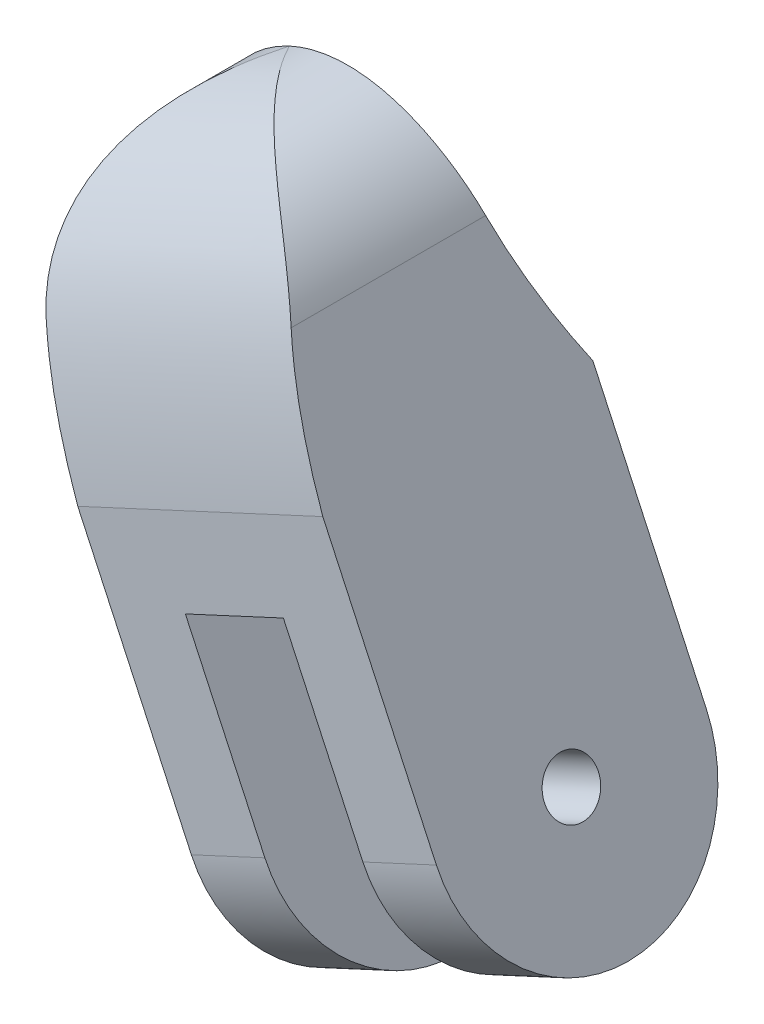
ISO-10303-21;
HEADER;
FILE_DESCRIPTION(('STEP AP214'),'2;1');
FILE_NAME('part.step','',(''),(''),'','','');
FILE_SCHEMA(('AUTOMOTIVE_DESIGN { 1 0 10303 214 1 1 1 1 }'));
ENDSEC;
DATA;
#1=APPLICATION_CONTEXT('core data for automotive mechanical design processes');
#2=APPLICATION_PROTOCOL_DEFINITION('international standard','automotive_design',2000,#1);
#3=PRODUCT_CONTEXT('',#1,'mechanical');
#4=PRODUCT('Part','Part','',(#3));
#5=PRODUCT_RELATED_PRODUCT_CATEGORY('part','',(#4));
#6=PRODUCT_DEFINITION_FORMATION('','',#4);
#7=PRODUCT_DEFINITION_CONTEXT('part definition',#1,'design');
#8=PRODUCT_DEFINITION('design','',#6,#7);
#9=PRODUCT_DEFINITION_SHAPE('','',#8);
#10=(LENGTH_UNIT() NAMED_UNIT(*) SI_UNIT(.MILLI.,.METRE.));
#11=(NAMED_UNIT(*) PLANE_ANGLE_UNIT() SI_UNIT($,.RADIAN.));
#12=(NAMED_UNIT(*) SI_UNIT($,.STERADIAN.) SOLID_ANGLE_UNIT());
#13=UNCERTAINTY_MEASURE_WITH_UNIT(LENGTH_MEASURE(1.E-05),#10,'distance_accuracy_value','');
#14=(GEOMETRIC_REPRESENTATION_CONTEXT(3) GLOBAL_UNCERTAINTY_ASSIGNED_CONTEXT((#13)) GLOBAL_UNIT_ASSIGNED_CONTEXT((#10,
#11,#12)) REPRESENTATION_CONTEXT('',''));
#15=CARTESIAN_POINT('',(0.,0.,0.));
#16=DIRECTION('',(0.,0.,1.));
#17=DIRECTION('',(1.,0.,0.));
#18=AXIS2_PLACEMENT_3D('',#15,#16,#17);
#19=CARTESIAN_POINT('',(-39.2611241479757,-18.1997343134974,10.));
#20=DIRECTION('',(0.907261631256999,0.420566680145836,0.));
#21=DIRECTION('',(-0.420566680145836,0.907261631256999,0.));
#22=AXIS2_PLACEMENT_3D('',#19,#20,#21);
#23=PLANE('',#22);
#24=CARTESIAN_POINT('',(-109.233059268317,132.746251177973,5.));
#25=DIRECTION('',(-0.907261631256999,-0.420566680145836,0.));
#26=DIRECTION('',(0.420566680145836,-0.907261631256999,0.));
#27=AXIS2_PLACEMENT_3D('',#24,#25,#26);
#28=CIRCLE('',#27,1.);
#29=CARTESIAN_POINT('',(-108.812492588171,131.838989546716,5.));
#30=VERTEX_POINT('',#29);
#31=EDGE_CURVE('E258',#30,#30,#28,.T.);
#32=ORIENTED_EDGE('',*,*,#31,.F.);
#33=EDGE_LOOP('',(#32));
#34=FACE_BOUND('',#33,.T.);
#35=DIRECTION('',(0.,0.,-1.));
#36=VECTOR('',#35,1.);
#37=CARTESIAN_POINT('',(-115.541559470504,146.355175646828,20.));
#38=LINE('',#37,#36);
#39=CARTESIAN_POINT('',(-115.541559470504,146.355175646828,9.06919902116083));
#40=VERTEX_POINT('',#39);
#41=CARTESIAN_POINT('',(-115.541559470504,146.355175646828,1.86727005609352));
#42=VERTEX_POINT('',#41);
#43=EDGE_CURVE('E129',#40,#42,#38,.T.);
#44=ORIENTED_EDGE('',*,*,#43,.T.);
#45=CARTESIAN_POINT('',(-117.644392871233,150.891483803113,2.5));
#46=CARTESIAN_POINT('',(-115.548545688467,146.370246568528,2.48869637864194));
#47=CARTESIAN_POINT('',(-113.438726069775,141.818867490543,0.));
#48=B_SPLINE_CURVE_WITH_KNOTS('',2,(#45,#46,#47),.UNSPECIFIED.,.F.,.F.,(3,3),(0.,1.),.UNSPECIFIED.);
#49=CARTESIAN_POINT('',(-113.438726069775,141.818867490543,0.));
#50=VERTEX_POINT('',#49);
#51=EDGE_CURVE('E205',#42,#50,#48,.T.);
#52=ORIENTED_EDGE('',*,*,#51,.T.);
#53=DIRECTION('',(0.420566680145836,-0.907261631256999,0.));
#54=VECTOR('',#53,1.);
#55=CARTESIAN_POINT('',(-39.2611241479757,-18.1997343134974,0.));
#56=LINE('',#55,#54);
#57=CARTESIAN_POINT('',(-109.233059268317,132.746251177973,0.));
#58=VERTEX_POINT('',#57);
#59=EDGE_CURVE('E362',#50,#58,#56,.T.);
#60=ORIENTED_EDGE('',*,*,#59,.T.);
#61=CARTESIAN_POINT('',(-109.233059268317,132.746251177973,5.));
#62=DIRECTION('',(-0.907261631256999,-0.420566680145836,0.));
#63=DIRECTION('',(0.420566680145836,-0.907261631256999,0.));
#64=AXIS2_PLACEMENT_3D('',#61,#62,#63);
#65=CIRCLE('',#64,5.);
#66=CARTESIAN_POINT('',(-109.233059268317,132.746251177973,10.));
#67=VERTEX_POINT('',#66);
#68=EDGE_CURVE('E264',#67,#58,#65,.F.);
#69=ORIENTED_EDGE('',*,*,#68,.F.);
#70=DIRECTION('',(0.420566680145836,-0.907261631256999,0.));
#71=VECTOR('',#70,1.);
#72=CARTESIAN_POINT('',(-39.2611241479757,-18.1997343134974,10.));
#73=LINE('',#72,#71);
#74=CARTESIAN_POINT('',(-113.438726069775,141.818867490543,10.));
#75=VERTEX_POINT('',#74);
#76=EDGE_CURVE('E347',#75,#67,#73,.T.);
#77=ORIENTED_EDGE('',*,*,#76,.F.);
#78=CARTESIAN_POINT('',(-113.438726069775,141.818867490543,10.));
#79=CARTESIAN_POINT('',(-117.644392871233,150.891483803113,9.3061485119152));
#80=CARTESIAN_POINT('',(-117.644392871233,150.891483803113,2.5));
#81=B_SPLINE_CURVE_WITH_KNOTS('',2,(#78,#79,#80),.UNSPECIFIED.,.F.,.F.,(3,3),(0.,1.),.UNSPECIFIED.);
#82=EDGE_CURVE('E243',#75,#40,#81,.T.);
#83=ORIENTED_EDGE('',*,*,#82,.T.);
#84=EDGE_LOOP('',(#44,#52,#60,#69,#77,#83));
#85=FACE_BOUND('',#84,.T.);
#86=ADVANCED_FACE('F109',(#34,#85),#23,.F.);
#87=CARTESIAN_POINT('',(-30.1885078354059,-13.9940675120391,10.));
#88=DIRECTION('',(0.907261631256999,0.420566680145835,0.));
#89=DIRECTION('',(-0.420566680145835,0.907261631256999,0.));
#90=AXIS2_PLACEMENT_3D('',#87,#88,#89);
#91=PLANE('',#90);
#92=CARTESIAN_POINT('',(-100.160442955747,136.951917979432,5.));
#93=DIRECTION('',(-0.907261631256999,-0.420566680145836,0.));
#94=DIRECTION('',(0.420566680145836,-0.907261631256999,0.));
#95=AXIS2_PLACEMENT_3D('',#92,#93,#94);
#96=CIRCLE('',#95,1.);
#97=CARTESIAN_POINT('',(-99.7398762756007,136.044656348175,5.));
#98=VERTEX_POINT('',#97);
#99=EDGE_CURVE('E250',#98,#98,#96,.T.);
#100=ORIENTED_EDGE('',*,*,#99,.T.);
#101=EDGE_LOOP('',(#100));
#102=FACE_BOUND('',#101,.T.);
#103=CARTESIAN_POINT('',(-108.571776558663,155.097150604572,2.5));
#104=CARTESIAN_POINT('',(-106.475929375897,150.575913369986,2.48869637864194));
#105=CARTESIAN_POINT('',(-104.366109757205,146.024534292002,0.));
#106=B_SPLINE_CURVE_WITH_KNOTS('',2,(#103,#104,#105),.UNSPECIFIED.,.F.,.F.,(3,3),(0.,1.),.UNSPECIFIED.);
#107=CARTESIAN_POINT('',(-106.468943157934,150.560842448287,1.86727005609351));
#108=VERTEX_POINT('',#107);
#109=CARTESIAN_POINT('',(-104.366109757205,146.024534292002,0.));
#110=VERTEX_POINT('',#109);
#111=EDGE_CURVE('E265',#108,#110,#106,.T.);
#112=ORIENTED_EDGE('',*,*,#111,.F.);
#113=DIRECTION('',(0.,0.,-1.));
#114=VECTOR('',#113,1.);
#115=CARTESIAN_POINT('',(-106.468943157934,150.560842448287,20.));
#116=LINE('',#115,#114);
#117=CARTESIAN_POINT('',(-106.468943157934,150.560842448287,9.06919902116082));
#118=VERTEX_POINT('',#117);
#119=EDGE_CURVE('E206',#118,#108,#116,.T.);
#120=ORIENTED_EDGE('',*,*,#119,.F.);
#121=CARTESIAN_POINT('',(-104.366109757205,146.024534292002,10.));
#122=CARTESIAN_POINT('',(-108.571776558663,155.097150604572,9.3061485119152));
#123=CARTESIAN_POINT('',(-108.571776558663,155.097150604572,2.5));
#124=B_SPLINE_CURVE_WITH_KNOTS('',2,(#121,#122,#123),.UNSPECIFIED.,.F.,.F.,(3,3),(0.,1.),.UNSPECIFIED.);
#125=CARTESIAN_POINT('',(-104.366109757205,146.024534292002,10.));
#126=VERTEX_POINT('',#125);
#127=EDGE_CURVE('E216',#126,#118,#124,.T.);
#128=ORIENTED_EDGE('',*,*,#127,.F.);
#129=DIRECTION('',(0.420566680145835,-0.907261631256999,0.));
#130=VECTOR('',#129,1.);
#131=CARTESIAN_POINT('',(-30.1885078354059,-13.9940675120391,10.));
#132=LINE('',#131,#130);
#133=CARTESIAN_POINT('',(-100.160442955747,136.951917979432,10.));
#134=VERTEX_POINT('',#133);
#135=EDGE_CURVE('E345',#126,#134,#132,.T.);
#136=ORIENTED_EDGE('',*,*,#135,.T.);
#137=CARTESIAN_POINT('',(-100.160442955747,136.951917979432,5.));
#138=DIRECTION('',(-0.907261631256999,-0.420566680145836,0.));
#139=DIRECTION('',(0.420566680145836,-0.907261631256999,0.));
#140=AXIS2_PLACEMENT_3D('',#137,#138,#139);
#141=CIRCLE('',#140,5.);
#142=CARTESIAN_POINT('',(-100.160442955747,136.951917979432,0.));
#143=VERTEX_POINT('',#142);
#144=EDGE_CURVE('E338',#134,#143,#141,.F.);
#145=ORIENTED_EDGE('',*,*,#144,.T.);
#146=DIRECTION('',(0.420566680145835,-0.907261631256999,0.));
#147=VECTOR('',#146,1.);
#148=CARTESIAN_POINT('',(-30.1885078354059,-13.9940675120391,0.));
#149=LINE('',#148,#147);
#150=EDGE_CURVE('E359',#110,#143,#149,.T.);
#151=ORIENTED_EDGE('',*,*,#150,.F.);
#152=EDGE_LOOP('',(#112,#120,#128,#136,#145,#151));
#153=FACE_BOUND('',#152,.T.);
#154=ADVANCED_FACE('F301',(#102,#153),#91,.T.);
#155=CARTESIAN_POINT('',(0.,0.,10.));
#156=DIRECTION('',(0.,0.,1.));
#157=DIRECTION('',(1.,0.,0.));
#158=AXIS2_PLACEMENT_3D('',#155,#156,#157);
#159=PLANE('',#158);
#160=ORIENTED_EDGE('',*,*,#76,.T.);
#161=DIRECTION('',(-0.907261631256999,-0.420566680145836,0.));
#162=VECTOR('',#161,1.);
#163=CARTESIAN_POINT('',(-100.160442955747,136.951917979432,10.));
#164=LINE('',#163,#162);
#165=CARTESIAN_POINT('',(-106.511274374545,134.007951218411,10.));
#166=VERTEX_POINT('',#165);
#167=EDGE_CURVE('E217',#67,#166,#164,.F.);
#168=ORIENTED_EDGE('',*,*,#167,.T.);
#169=DIRECTION('',(-0.420566680145836,0.907261631256999,0.));
#170=VECTOR('',#169,1.);
#171=CARTESIAN_POINT('',(-36.5393392542046,-16.9380342730599,10.));
#172=LINE('',#171,#170);
#173=CARTESIAN_POINT('',(-109.455241135566,140.35878263721,10.));
#174=VERTEX_POINT('',#173);
#175=EDGE_CURVE('E353',#166,#174,#172,.T.);
#176=ORIENTED_EDGE('',*,*,#175,.T.);
#177=DIRECTION('',(0.907261631256999,0.420566680145835,0.));
#178=VECTOR('',#177,1.);
#179=CARTESIAN_POINT('',(-72.9159018813616,157.29681691027,10.));
#180=LINE('',#179,#178);
#181=CARTESIAN_POINT('',(-105.826194610538,142.041049357793,10.));
#182=VERTEX_POINT('',#181);
#183=EDGE_CURVE('E343',#174,#182,#180,.T.);
#184=ORIENTED_EDGE('',*,*,#183,.T.);
#185=DIRECTION('',(0.420566680145835,-0.907261631256999,0.));
#186=VECTOR('',#185,1.);
#187=CARTESIAN_POINT('',(-32.9102927291768,-15.2557675524766,10.));
#188=LINE('',#187,#186);
#189=CARTESIAN_POINT('',(-102.882227849518,135.690217938994,10.));
#190=VERTEX_POINT('',#189);
#191=EDGE_CURVE('E330',#182,#190,#188,.T.);
#192=ORIENTED_EDGE('',*,*,#191,.T.);
#193=DIRECTION('',(-0.907261631256999,-0.420566680145836,0.));
#194=VECTOR('',#193,1.);
#195=CARTESIAN_POINT('',(-100.160442955747,136.951917979432,10.));
#196=LINE('',#195,#194);
#197=EDGE_CURVE('E211',#134,#190,#196,.T.);
#198=ORIENTED_EDGE('',*,*,#197,.F.);
#199=ORIENTED_EDGE('',*,*,#135,.F.);
#200=DIRECTION('',(-0.907261631256999,-0.420566680145836,0.));
#201=VECTOR('',#200,1.);
#202=CARTESIAN_POINT('',(-104.366109757205,146.024534292002,10.));
#203=LINE('',#202,#201);
#204=EDGE_CURVE('E242',#126,#75,#203,.T.);
#205=ORIENTED_EDGE('',*,*,#204,.T.);
#206=EDGE_LOOP('',(#160,#168,#176,#184,#192,#198,#199,#205));
#207=FACE_BOUND('',#206,.T.);
#208=ADVANCED_FACE('F307',(#207),#159,.T.);
#209=CARTESIAN_POINT('',(-32.9102927291768,-15.2557675524766,10.));
#210=DIRECTION('',(0.907261631256999,0.420566680145835,0.));
#211=DIRECTION('',(-0.420566680145835,0.907261631256999,0.));
#212=AXIS2_PLACEMENT_3D('',#209,#210,#211);
#213=PLANE('',#212);
#214=CARTESIAN_POINT('',(-102.882227849517,135.690217938994,5.));
#215=DIRECTION('',(0.907261631256999,0.420566680145835,0.));
#216=DIRECTION('',(-0.420566680145835,0.907261631256999,0.));
#217=AXIS2_PLACEMENT_3D('',#214,#215,#216);
#218=CIRCLE('',#217,1.);
#219=CARTESIAN_POINT('',(-103.302794529663,136.597479570251,5.));
#220=VERTEX_POINT('',#219);
#221=EDGE_CURVE('E261',#220,#220,#218,.T.);
#222=ORIENTED_EDGE('',*,*,#221,.T.);
#223=EDGE_LOOP('',(#222));
#224=FACE_BOUND('',#223,.T.);
#225=CARTESIAN_POINT('',(-102.882227849517,135.690217938994,5.));
#226=DIRECTION('',(0.907261631256999,0.420566680145835,0.));
#227=DIRECTION('',(-0.420566680145835,0.907261631256999,0.));
#228=AXIS2_PLACEMENT_3D('',#225,#226,#227);
#229=CIRCLE('',#228,5.);
#230=CARTESIAN_POINT('',(-102.882227849518,135.690217938994,0.));
#231=VERTEX_POINT('',#230);
#232=EDGE_CURVE('E137',#231,#190,#229,.F.);
#233=ORIENTED_EDGE('',*,*,#232,.T.);
#234=ORIENTED_EDGE('',*,*,#191,.F.);
#235=DIRECTION('',(0.,0.,-1.));
#236=VECTOR('',#235,1.);
#237=CARTESIAN_POINT('',(-105.826194610538,142.041049357793,10.));
#238=LINE('',#237,#236);
#239=CARTESIAN_POINT('',(-105.826194610538,142.041049357793,0.));
#240=VERTEX_POINT('',#239);
#241=EDGE_CURVE('E368',#182,#240,#238,.T.);
#242=ORIENTED_EDGE('',*,*,#241,.T.);
#243=DIRECTION('',(0.420566680145835,-0.907261631256999,0.));
#244=VECTOR('',#243,1.);
#245=CARTESIAN_POINT('',(-32.9102927291768,-15.2557675524766,0.));
#246=LINE('',#245,#244);
#247=EDGE_CURVE('E332',#240,#231,#246,.T.);
#248=ORIENTED_EDGE('',*,*,#247,.T.);
#249=EDGE_LOOP('',(#233,#234,#242,#248));
#250=FACE_BOUND('',#249,.T.);
#251=ADVANCED_FACE('F315',(#224,#250),#213,.F.);
#252=CARTESIAN_POINT('',(-36.5393392542046,-16.9380342730599,10.));
#253=DIRECTION('',(-0.907261631256999,-0.420566680145836,0.));
#254=DIRECTION('',(0.420566680145836,-0.907261631256999,0.));
#255=AXIS2_PLACEMENT_3D('',#252,#253,#254);
#256=PLANE('',#255);
#257=CARTESIAN_POINT('',(-106.511274374545,134.007951218411,5.));
#258=DIRECTION('',(-0.907261631256999,-0.420566680145836,0.));
#259=DIRECTION('',(0.420566680145836,-0.907261631256999,0.));
#260=AXIS2_PLACEMENT_3D('',#257,#258,#259);
#261=CIRCLE('',#260,1.);
#262=CARTESIAN_POINT('',(-106.0907076944,133.100689587154,5.));
#263=VERTEX_POINT('',#262);
#264=EDGE_CURVE('E227',#263,#263,#261,.T.);
#265=ORIENTED_EDGE('',*,*,#264,.T.);
#266=EDGE_LOOP('',(#265));
#267=FACE_BOUND('',#266,.T.);
#268=ORIENTED_EDGE('',*,*,#175,.F.);
#269=CARTESIAN_POINT('',(-106.511274374545,134.007951218411,5.));
#270=DIRECTION('',(-0.907261631256999,-0.420566680145836,0.));
#271=DIRECTION('',(0.420566680145836,-0.907261631256999,0.));
#272=AXIS2_PLACEMENT_3D('',#269,#270,#271);
#273=CIRCLE('',#272,5.);
#274=CARTESIAN_POINT('',(-106.511274374545,134.007951218411,0.));
#275=VERTEX_POINT('',#274);
#276=EDGE_CURVE('E334',#166,#275,#273,.F.);
#277=ORIENTED_EDGE('',*,*,#276,.T.);
#278=DIRECTION('',(-0.420566680145836,0.907261631256999,0.));
#279=VECTOR('',#278,1.);
#280=CARTESIAN_POINT('',(-36.5393392542046,-16.9380342730599,0.));
#281=LINE('',#280,#279);
#282=CARTESIAN_POINT('',(-109.455241135566,140.35878263721,0.));
#283=VERTEX_POINT('',#282);
#284=EDGE_CURVE('E349',#275,#283,#281,.T.);
#285=ORIENTED_EDGE('',*,*,#284,.T.);
#286=DIRECTION('',(0.,0.,-1.));
#287=VECTOR('',#286,1.);
#288=CARTESIAN_POINT('',(-109.455241135566,140.35878263721,10.));
#289=LINE('',#288,#287);
#290=EDGE_CURVE('E355',#174,#283,#289,.T.);
#291=ORIENTED_EDGE('',*,*,#290,.F.);
#292=EDGE_LOOP('',(#268,#277,#285,#291));
#293=FACE_BOUND('',#292,.T.);
#294=ADVANCED_FACE('F313',(#267,#293),#256,.F.);
#295=CARTESIAN_POINT('',(0.,0.,0.));
#296=DIRECTION('',(0.,0.,1.));
#297=DIRECTION('',(1.,0.,0.));
#298=AXIS2_PLACEMENT_3D('',#295,#296,#297);
#299=PLANE('',#298);
#300=DIRECTION('',(-0.907261631256999,-0.420566680145836,0.));
#301=VECTOR('',#300,1.);
#302=CARTESIAN_POINT('',(-104.366109757205,146.024534292002,0.));
#303=LINE('',#302,#301);
#304=EDGE_CURVE('E270',#110,#50,#303,.T.);
#305=ORIENTED_EDGE('',*,*,#304,.F.);
#306=ORIENTED_EDGE('',*,*,#150,.T.);
#307=DIRECTION('',(-0.907261631256999,-0.420566680145836,0.));
#308=VECTOR('',#307,1.);
#309=CARTESIAN_POINT('',(-100.160442955747,136.951917979432,0.));
#310=LINE('',#309,#308);
#311=EDGE_CURVE('E518',#143,#231,#310,.T.);
#312=ORIENTED_EDGE('',*,*,#311,.T.);
#313=ORIENTED_EDGE('',*,*,#247,.F.);
#314=DIRECTION('',(0.907261631256999,0.420566680145835,0.));
#315=VECTOR('',#314,1.);
#316=CARTESIAN_POINT('',(-72.9159018813616,157.29681691027,0.));
#317=LINE('',#316,#315);
#318=EDGE_CURVE('E333',#283,#240,#317,.T.);
#319=ORIENTED_EDGE('',*,*,#318,.F.);
#320=ORIENTED_EDGE('',*,*,#284,.F.);
#321=DIRECTION('',(-0.907261631256999,-0.420566680145836,0.));
#322=VECTOR('',#321,1.);
#323=CARTESIAN_POINT('',(-100.160442955747,136.951917979432,0.));
#324=LINE('',#323,#322);
#325=EDGE_CURVE('E219',#58,#275,#324,.F.);
#326=ORIENTED_EDGE('',*,*,#325,.F.);
#327=ORIENTED_EDGE('',*,*,#59,.F.);
#328=EDGE_LOOP('',(#305,#306,#312,#313,#319,#320,#326,#327));
#329=FACE_BOUND('',#328,.T.);
#330=ADVANCED_FACE('F322',(#329),#299,.F.);
#331=CARTESIAN_POINT('',(-72.9159018813616,157.29681691027,10.));
#332=DIRECTION('',(-0.420566680145835,0.907261631256999,0.));
#333=DIRECTION('',(-0.907261631256999,-0.420566680145835,0.));
#334=AXIS2_PLACEMENT_3D('',#331,#332,#333);
#335=PLANE('',#334);
#336=ORIENTED_EDGE('',*,*,#318,.T.);
#337=ORIENTED_EDGE('',*,*,#241,.F.);
#338=ORIENTED_EDGE('',*,*,#183,.F.);
#339=ORIENTED_EDGE('',*,*,#290,.T.);
#340=EDGE_LOOP('',(#336,#337,#338,#339));
#341=FACE_BOUND('',#340,.T.);
#342=ADVANCED_FACE('F111',(#341),#335,.F.);
#343=CARTESIAN_POINT('',(-100.160442955747,136.951917979432,5.));
#344=DIRECTION('',(-0.907261631256999,-0.420566680145836,0.));
#345=DIRECTION('',(0.420566680145836,-0.907261631256999,0.));
#346=AXIS2_PLACEMENT_3D('',#343,#344,#345);
#347=CYLINDRICAL_SURFACE('',#346,5.);
#348=ORIENTED_EDGE('',*,*,#311,.F.);
#349=ORIENTED_EDGE('',*,*,#144,.F.);
#350=ORIENTED_EDGE('',*,*,#197,.T.);
#351=ORIENTED_EDGE('',*,*,#232,.F.);
#352=EDGE_LOOP('',(#348,#349,#350,#351));
#353=FACE_BOUND('',#352,.T.);
#354=ADVANCED_FACE('F281',(#353),#347,.T.);
#355=ORIENTED_EDGE('',*,*,#276,.F.);
#356=ORIENTED_EDGE('',*,*,#167,.F.);
#357=ORIENTED_EDGE('',*,*,#68,.T.);
#358=ORIENTED_EDGE('',*,*,#325,.T.);
#359=EDGE_LOOP('',(#355,#356,#357,#358));
#360=FACE_BOUND('',#359,.T.);
#361=ADVANCED_FACE('F280',(#360),#347,.T.);
#362=DIRECTION('',(-0.907261631256999,-0.420566680145836,0.));
#363=VECTOR('',#362,1.);
#364=SURFACE_OF_LINEAR_EXTRUSION('',#106,#363);
#365=CARTESIAN_POINT('',(-113.108084714948,152.994317203842,2.5));
#366=CARTESIAN_POINT('',(-113.235592939498,152.935226611646,2.49998891900395));
#367=CARTESIAN_POINT('',(-113.360594934315,152.870734587783,2.49998621339652));
#368=CARTESIAN_POINT('',(-113.604725524311,152.731466804576,2.49991746156707));
#369=CARTESIAN_POINT('',(-113.723854382801,152.656691506837,2.49985141818741));
#370=CARTESIAN_POINT('',(-113.955315374084,152.497421816004,2.4995760008361));
#371=CARTESIAN_POINT('',(-114.067651801781,152.412933664593,2.49936671848914));
#372=CARTESIAN_POINT('',(-114.284814087673,152.234804937368,2.49865026363641));
#373=CARTESIAN_POINT('',(-114.389640038505,152.141164474477,2.49814309480565));
#374=CARTESIAN_POINT('',(-114.591071772486,151.945361549247,2.49662765684544));
#375=CARTESIAN_POINT('',(-114.687674731801,151.843196183057,2.49561921638238));
#376=CARTESIAN_POINT('',(-114.871966362283,151.631061647607,2.49285096463644));
#377=CARTESIAN_POINT('',(-114.959651730925,151.521089612655,2.49109087623508));
#378=CARTESIAN_POINT('',(-115.125397452099,151.294224876378,2.48653478990316));
#379=CARTESIAN_POINT('',(-115.203462821424,151.17733582973,2.48373933498513));
#380=CARTESIAN_POINT('',(-115.349489327248,150.937389431247,2.47680087312037));
#381=CARTESIAN_POINT('',(-115.417446964475,150.814329962851,2.47265740106848));
#382=CARTESIAN_POINT('',(-115.542563735528,150.563336419015,2.46271409572053));
#383=CARTESIAN_POINT('',(-115.599752800995,150.435417079433,2.45691896958579));
#384=CARTESIAN_POINT('',(-115.703167680198,150.175322987603,2.44334848837997));
#385=CARTESIAN_POINT('',(-115.749393608643,150.043148279895,2.43557315402966));
#386=CARTESIAN_POINT('',(-115.830574617792,149.775511399892,2.41773716755498));
#387=CARTESIAN_POINT('',(-115.865528151144,149.640048779009,2.40767620200665));
#388=CARTESIAN_POINT('',(-115.923926395862,149.366925885963,2.38499955965461));
#389=CARTESIAN_POINT('',(-115.94737525631,149.229266424595,2.37238480617894));
#390=CARTESIAN_POINT('',(-115.982491835058,148.954115293168,2.34450680772687));
#391=CARTESIAN_POINT('',(-115.994273649417,148.816635400016,2.32927095798157));
#392=CARTESIAN_POINT('',(-116.006447501871,148.54157481051,2.29590447583367));
#393=CARTESIAN_POINT('',(-116.006843637935,148.403994168248,2.27777488731723));
#394=CARTESIAN_POINT('',(-115.996346776204,148.129674850024,2.23850687934002));
#395=CARTESIAN_POINT('',(-115.985452485008,147.992936272332,2.21736811539576));
#396=CARTESIAN_POINT('',(-115.952580683742,147.721359156864,2.172059012512));
#397=CARTESIAN_POINT('',(-115.930605299351,147.586520259772,2.14788925567386));
#398=CARTESIAN_POINT('',(-115.864124404428,147.262554411829,2.08555287696173));
#399=CARTESIAN_POINT('',(-115.814004984533,147.074836283443,2.0458169631835));
#400=CARTESIAN_POINT('',(-115.723243539809,146.799731832288,1.98194551742241));
#401=CARTESIAN_POINT('',(-115.690420211808,146.709168389183,1.95996013200232));
#402=CARTESIAN_POINT('',(-115.619731892091,146.530367741978,1.91462314961919));
#403=CARTESIAN_POINT('',(-115.581866312149,146.442130810728,1.89127139343467));
#404=CARTESIAN_POINT('',(-115.541559470504,146.355175646828,1.86727005609351));
#405=B_SPLINE_CURVE_WITH_KNOTS('',3,(#365,#366,#367,#368,#369,#370,#371,#372,#373,#374,#375,
#376,#377,#378,#379,#380,#381,#382,#383,#384,#385,#386,#387,#388,#389,#390,#391,#392,#393,#394,
#395,#396,#397,#398,#399,#400,#401,#402,#403,#404),.UNSPECIFIED.,.F.,.F.,(4,2,2,2,2,2,2,2,2,2,2,
2,2,2,2,2,2,2,2,4),(0.,0.421476087944817,0.842933262483793,1.26412109802152,1.68530373751448,
2.10663043545419,2.52811260291884,2.94937403042535,3.3707809598117,3.79099870077557,
4.21121204479145,4.63148304662867,5.05160236899912,5.46757138314876,5.8833906785383,
6.29925761430423,6.71504480490039,7.30840577519417,7.6046845292415,7.90099787730575),.UNSPECIFIED.);
#406=CARTESIAN_POINT('',(-113.108084714948,152.994317203842,2.5));
#407=VERTEX_POINT('',#406);
#408=EDGE_CURVE('E193',#407,#42,#405,.T.);
#409=ORIENTED_EDGE('',*,*,#408,.F.);
#410=CARTESIAN_POINT('',(-106.468943157934,150.560842448287,1.86727005609351));
#411=CARTESIAN_POINT('',(-106.526285823426,150.6845799532,1.90143463630009));
#412=CARTESIAN_POINT('',(-106.588861811323,150.806268801566,1.93427981451765));
#413=CARTESIAN_POINT('',(-106.724137221981,151.044668867663,1.99715140514195));
#414=CARTESIAN_POINT('',(-106.796838189421,151.161379322329,2.02717738627602));
#415=CARTESIAN_POINT('',(-106.951987994554,151.388882495265,2.08421469625354));
#416=CARTESIAN_POINT('',(-107.034434992329,151.499676324799,2.11122659224937));
#417=CARTESIAN_POINT('',(-107.208599879918,151.714472021216,2.16214570628074));
#418=CARTESIAN_POINT('',(-107.300317076818,151.818474394781,2.18605315605711));
#419=CARTESIAN_POINT('',(-107.492579465013,152.018971473086,2.23077220952274));
#420=CARTESIAN_POINT('',(-107.59313629722,152.115455952496,2.25157963065369));
#421=CARTESIAN_POINT('',(-107.802333382151,152.299984726068,2.29012165106405));
#422=CARTESIAN_POINT('',(-107.9109766356,152.388025859043,2.30785510144043));
#423=CARTESIAN_POINT('',(-108.135446138223,152.554806766326,2.34035169743645));
#424=CARTESIAN_POINT('',(-108.251265873163,152.633554792878,2.35511748664725));
#425=CARTESIAN_POINT('',(-108.489381526886,152.781205907719,2.38189485174664));
#426=CARTESIAN_POINT('',(-108.611679812269,152.850105363879,2.39390541249605));
#427=CARTESIAN_POINT('',(-108.859618010489,152.976335041657,2.41522233739735));
#428=CARTESIAN_POINT('',(-108.985161747938,153.03384691623,2.42457241953402));
#429=CARTESIAN_POINT('',(-109.240745133057,153.138349387568,2.44111939434592));
#430=CARTESIAN_POINT('',(-109.370786410392,153.185336123492,2.44831549722098));
#431=CARTESIAN_POINT('',(-109.634386716194,153.26839629872,2.46084653917666));
#432=CARTESIAN_POINT('',(-109.76794554312,153.304470361804,2.46618158464002));
#433=CARTESIAN_POINT('',(-110.037691255067,153.36544780833,2.47530135868939));
#434=CARTESIAN_POINT('',(-110.173879078236,153.390347124276,2.47908552272652));
#435=CARTESIAN_POINT('',(-110.448567675536,153.428867493491,2.48542389433174));
#436=CARTESIAN_POINT('',(-110.587076635734,153.44243121647,2.48797182270386));
#437=CARTESIAN_POINT('',(-110.864757337606,153.457969149666,2.49210661303961));
#438=CARTESIAN_POINT('',(-111.00392909067,153.459943159989,2.49369345842651));
#439=CARTESIAN_POINT('',(-111.281908784667,153.452283741958,2.49617714623369));
#440=CARTESIAN_POINT('',(-111.420716849789,153.44265499914,2.49707426694565));
#441=CARTESIAN_POINT('',(-111.697008709616,153.411876937444,2.49841302832791));
#442=CARTESIAN_POINT('',(-111.834492675064,153.390729124759,2.49885472852555));
#443=CARTESIAN_POINT('',(-112.166995504611,153.325270697102,2.49961333307202));
#444=CARTESIAN_POINT('',(-112.360866751684,153.274873894389,2.49979106373963));
#445=CARTESIAN_POINT('',(-112.645859311278,153.182244325841,2.49993449422315));
#446=CARTESIAN_POINT('',(-112.739850518107,153.148546005423,2.49996179078214));
#447=CARTESIAN_POINT('',(-112.925666388709,153.075579879209,2.49999352048449));
#448=CARTESIAN_POINT('',(-113.017490636723,153.036311014604,2.4999979492753));
#449=CARTESIAN_POINT('',(-113.108084714948,152.994317203842,2.5));
#450=B_SPLINE_CURVE_WITH_KNOTS('',3,(#410,#411,#412,#413,#414,#415,#416,#417,#418,#419,#420,
#421,#422,#423,#424,#425,#426,#427,#428,#429,#430,#431,#432,#433,#434,#435,#436,#437,#438,#439,
#440,#441,#442,#443,#444,#445,#446,#447,#448,#449),.UNSPECIFIED.,.F.,.F.,(4,2,2,2,2,2,2,2,2,2,2,
2,2,2,2,2,2,2,2,4),(0.,0.421677920794978,0.843420243926675,1.26508307462747,1.6867144109074,
2.10890955847178,2.53126216371582,2.9532368534469,3.3753667671477,3.79009595312077,
4.20497702220027,4.61983437174102,5.03484260301189,5.45193726925531,5.86903912932452,
6.28597260773342,6.70285158246587,7.30214064338953,7.60154032624553,7.90099699333784),.UNSPECIFIED.);
#451=EDGE_CURVE('E202',#108,#407,#450,.T.);
#452=ORIENTED_EDGE('',*,*,#451,.F.);
#453=ORIENTED_EDGE('',*,*,#111,.T.);
#454=ORIENTED_EDGE('',*,*,#304,.T.);
#455=ORIENTED_EDGE('',*,*,#51,.F.);
#456=EDGE_LOOP('',(#409,#452,#453,#454,#455));
#457=FACE_BOUND('',#456,.T.);
#458=ADVANCED_FACE('F201',(#457),#364,.T.);
#459=DIRECTION('',(-0.907261631256999,-0.420566680145836,0.));
#460=VECTOR('',#459,1.);
#461=SURFACE_OF_LINEAR_EXTRUSION('',#124,#460);
#462=CARTESIAN_POINT('',(-115.541559470504,146.355175646828,9.06919902116074));
#463=CARTESIAN_POINT('',(-115.60323526657,146.488156203961,9.01772553864228));
#464=CARTESIAN_POINT('',(-115.658584721479,146.622948952057,8.96346241806658));
#465=CARTESIAN_POINT('',(-115.75673943657,146.894638310024,8.84942100582711));
#466=CARTESIAN_POINT('',(-115.799553090949,147.031533447156,8.78964644015419));
#467=CARTESIAN_POINT('',(-115.872595472259,147.305221513354,8.66497242903769));
#468=CARTESIAN_POINT('',(-115.902902051372,147.442009617004,8.6001077728349));
#469=CARTESIAN_POINT('',(-115.951691732007,147.715068645439,8.46503923536383));
#470=CARTESIAN_POINT('',(-115.970173256836,147.851339498849,8.39483464349155));
#471=CARTESIAN_POINT('',(-115.995781385885,148.121823733209,8.24945916880337));
#472=CARTESIAN_POINT('',(-116.002936869621,148.256041480013,8.17430142764593));
#473=CARTESIAN_POINT('',(-116.006611108275,148.521802434385,8.01905992197701));
#474=CARTESIAN_POINT('',(-116.003125626016,148.65334455554,7.93897420761369));
#475=CARTESIAN_POINT('',(-115.986210477833,148.912967697087,7.77407966342288));
#476=CARTESIAN_POINT('',(-115.972769998658,149.041044796804,7.68926579051498));
#477=CARTESIAN_POINT('',(-115.936699090617,149.292881268001,7.5152781002088));
#478=CARTESIAN_POINT('',(-115.914066875928,149.416639795369,7.42610343853498));
#479=CARTESIAN_POINT('',(-115.850255172544,149.705099414269,7.20922370980865));
#480=CARTESIAN_POINT('',(-115.805298851207,149.867603007806,7.07969066285766));
#481=CARTESIAN_POINT('',(-115.701490948916,150.182187569234,6.8137166425414));
#482=CARTESIAN_POINT('',(-115.642635208119,150.33426539927,6.67727361076549));
#483=CARTESIAN_POINT('',(-115.512905350603,150.627525961593,6.39804020120851));
#484=CARTESIAN_POINT('',(-115.44201182468,150.768690554291,6.25523985193439));
#485=CARTESIAN_POINT('',(-115.290103144487,151.039512961077,5.96419582407065));
#486=CARTESIAN_POINT('',(-115.20908535642,151.16916776586,5.81595073615949));
#487=CARTESIAN_POINT('',(-115.00912030744,151.459670473642,5.46257294277004));
#488=CARTESIAN_POINT('',(-114.886744414914,151.615802865334,5.25549394602137));
#489=CARTESIAN_POINT('',(-114.630243881988,151.907232176716,4.83403452024813));
#490=CARTESIAN_POINT('',(-114.496114032006,152.04251978357,4.61965087965546));
#491=CARTESIAN_POINT('',(-114.219258778752,152.292710928915,4.18500921902144));
#492=CARTESIAN_POINT('',(-114.076540632277,152.407631361757,3.96475624366162));
#493=CARTESIAN_POINT('',(-113.784959969973,152.617999715458,3.51926274440962));
#494=CARTESIAN_POINT('',(-113.636100286294,152.713456493863,3.29402454116761));
#495=CARTESIAN_POINT('',(-113.42464770001,152.834238526294,2.97546636487971));
#496=CARTESIAN_POINT('',(-113.363756632876,152.86733956089,2.88389008630075));
#497=CARTESIAN_POINT('',(-113.241456225006,152.930606135214,2.70014369893054));
#498=CARTESIAN_POINT('',(-113.18004719943,152.960773337226,2.60797395832923));
#499=CARTESIAN_POINT('',(-113.114977547449,152.991117216591,2.51034189833438));
#500=CARTESIAN_POINT('',(-113.111531462236,152.992719442923,2.50517140408894));
#501=CARTESIAN_POINT('',(-113.108084714948,152.994317203842,2.50000000000015));
#502=B_SPLINE_CURVE_WITH_KNOTS('',3,(#462,#463,#464,#465,#466,#467,#468,#469,#470,#471,#472,
#473,#474,#475,#476,#477,#478,#479,#480,#481,#482,#483,#484,#485,#486,#487,#488,#489,#490,#491,
#492,#493,#494,#495,#496,#497,#498,#499,#500,#501),.UNSPECIFIED.,.F.,.F.,(4,2,2,2,2,2,2,2,2,2,2,
2,2,2,2,2,2,2,2,4),(0.,0.465871241287709,0.931429809642161,1.39404506131548,1.85672198289414,
2.31821724388564,2.77989629377981,3.24207756236204,3.70434866910949,4.34127628707767,
4.97839476798404,5.61655043894154,6.25487247125208,7.11390736668165,7.97332494755655,
8.83202627984304,9.69033595668607,10.0348480472962,10.3791637889106,10.3984144889371),.UNSPECIFIED.);
#503=EDGE_CURVE('E12',#40,#407,#502,.T.);
#504=ORIENTED_EDGE('',*,*,#503,.F.);
#505=ORIENTED_EDGE('',*,*,#82,.F.);
#506=ORIENTED_EDGE('',*,*,#204,.F.);
#507=ORIENTED_EDGE('',*,*,#127,.T.);
#508=CARTESIAN_POINT('',(-106.468943157934,150.560842448287,9.06919902116075));
#509=CARTESIAN_POINT('',(-106.530566528957,150.69384730737,9.01772553864227));
#510=CARTESIAN_POINT('',(-106.597661214801,150.823195481803,8.96346241806654));
#511=CARTESIAN_POINT('',(-106.741562754787,151.073678619194,8.84942100582698));
#512=CARTESIAN_POINT('',(-106.81836306031,151.194819036244,8.78964644015403));
#513=CARTESIAN_POINT('',(-106.980018649344,151.427429907832,8.66497242903751));
#514=CARTESIAN_POINT('',(-107.064819938678,151.53895665514,8.60010777283476));
#515=CARTESIAN_POINT('',(-107.241668734545,151.752653097193,8.46503923536377));
#516=CARTESIAN_POINT('',(-107.333717205544,151.854821542595,8.39483464349154));
#517=CARTESIAN_POINT('',(-107.523582119832,152.049163539171,8.24945916880339));
#518=CARTESIAN_POINT('',(-107.621383231516,152.141361950535,8.17430142764594));
#519=CARTESIAN_POINT('',(-107.821818396693,152.315913173558,8.01905992197702));
#520=CARTESIAN_POINT('',(-107.924454359378,152.398262049618,7.93897420761371));
#521=CARTESIAN_POINT('',(-108.133511423954,152.553134389354,7.7740796634229));
#522=CARTESIAN_POINT('',(-108.239936521902,152.625647067413,7.68926579051498));
#523=CARTESIAN_POINT('',(-108.455430718876,152.760868995008,7.51527810020879));
#524=CARTESIAN_POINT('',(-108.564500327819,152.823576336228,7.42610343853497));
#525=CARTESIAN_POINT('',(-108.825870090217,152.96129609708,7.20922370980871));
#526=CARTESIAN_POINT('',(-108.978934039396,153.032006182654,7.0796906628578));
#527=CARTESIAN_POINT('',(-109.286087914535,153.156086897732,6.8137166425417));
#528=CARTESIAN_POINT('',(-109.440178134196,153.209452324912,6.67727361076589));
#529=CARTESIAN_POINT('',(-109.747811062506,153.299970691911,6.39804020120894));
#530=CARTESIAN_POINT('',(-109.901352471474,153.33709709736,6.25523985193475));
#531=CARTESIAN_POINT('',(-110.206195219526,153.396189585003,5.96419582407082));
#532=CARTESIAN_POINT('',(-110.35749596421,153.418151712515,5.81595073615953));
#533=CARTESIAN_POINT('',(-110.708413601747,153.453289380449,5.4625729427695));
#534=CARTESIAN_POINT('',(-110.906647699816,153.460801049386,5.25549394602038));
#535=CARTESIAN_POINT('',(-111.294808360366,153.453393720245,4.83403452024585));
#536=CARTESIAN_POINT('',(-111.484731182641,153.438464728196,4.61965087965233));
#537=CARTESIAN_POINT('',(-111.854576026777,153.388874086635,4.18500921901941));
#538=CARTESIAN_POINT('',(-112.034506251504,153.354228892918,3.96475624366156));
#539=CARTESIAN_POINT('',(-112.383477463671,153.267665506065,3.51926274440693));
#540=CARTESIAN_POINT('',(-112.552523380282,153.215755198387,3.29402454116032));
#541=CARTESIAN_POINT('',(-112.781346204492,153.132444870508,2.97546636488267));
#542=CARTESIAN_POINT('',(-112.845957221506,153.107368646127,2.88389008630853));
#543=CARTESIAN_POINT('',(-112.973274030039,153.054923632533,2.70014369892241));
#544=CARTESIAN_POINT('',(-113.035980886422,153.027556158076,2.60797395830038));
#545=CARTESIAN_POINT('',(-113.10118824036,152.99750933426,2.51034189833119));
#546=CARTESIAN_POINT('',(-113.104637967562,152.995914964556,2.50517140408727));
#547=CARTESIAN_POINT('',(-113.108084714948,152.994317203842,2.50000000000015));
#548=B_SPLINE_CURVE_WITH_KNOTS('',3,(#508,#509,#510,#511,#512,#513,#514,#515,#516,#517,#518,
#519,#520,#521,#522,#523,#524,#525,#526,#527,#528,#529,#530,#531,#532,#533,#534,#535,#536,#537,
#538,#539,#540,#541,#542,#543,#544,#545,#546,#547),.UNSPECIFIED.,.F.,.F.,(4,2,2,2,2,2,2,2,2,2,2,
2,2,2,2,2,2,2,2,4),(0.,0.465871241287954,0.931429809642614,1.39404506131569,1.85672198289416,
2.31821724388564,2.77989629377981,3.24207756236205,3.70434866910955,4.3412762870773,
4.97839476798327,5.61655043894119,6.25487247125215,7.11390736668396,7.97332494756074,
8.83202627984476,9.69033595668617,10.0348480472959,10.3791637889106,10.3984144889371),.UNSPECIFIED.);
#549=EDGE_CURVE('E123',#407,#118,#548,.F.);
#550=ORIENTED_EDGE('',*,*,#549,.F.);
#551=EDGE_LOOP('',(#504,#505,#506,#507,#550));
#552=FACE_BOUND('',#551,.T.);
#553=ADVANCED_FACE('F214',(#552),#461,.T.);
#554=CARTESIAN_POINT('',(-100.160442955747,136.951917979432,5.));
#555=DIRECTION('',(-0.907261631256999,-0.420566680145836,0.));
#556=DIRECTION('',(0.420566680145836,-0.907261631256999,0.));
#557=AXIS2_PLACEMENT_3D('',#554,#555,#556);
#558=CYLINDRICAL_SURFACE('',#557,1.);
#559=ORIENTED_EDGE('',*,*,#31,.T.);
#560=EDGE_LOOP('',(#559));
#561=FACE_BOUND('',#560,.T.);
#562=ORIENTED_EDGE('',*,*,#264,.F.);
#563=EDGE_LOOP('',(#562));
#564=FACE_BOUND('',#563,.T.);
#565=ADVANCED_FACE('F233',(#561,#564),#558,.F.);
#566=ORIENTED_EDGE('',*,*,#99,.F.);
#567=EDGE_LOOP('',(#566));
#568=FACE_BOUND('',#567,.T.);
#569=ORIENTED_EDGE('',*,*,#221,.F.);
#570=EDGE_LOOP('',(#569));
#571=FACE_BOUND('',#570,.T.);
#572=ADVANCED_FACE('F234',(#568,#571),#558,.F.);
#573=CARTESIAN_POINT('',(-111.005251314219,148.458009047557,20.));
#574=DIRECTION('',(0.,0.,-1.));
#575=DIRECTION('',(-1.,0.,0.));
#576=AXIS2_PLACEMENT_3D('',#573,#574,#575);
#577=CYLINDRICAL_SURFACE('',#576,5.00000000000002);
#578=ORIENTED_EDGE('',*,*,#451,.T.);
#579=ORIENTED_EDGE('',*,*,#549,.T.);
#580=ORIENTED_EDGE('',*,*,#119,.T.);
#581=EDGE_LOOP('',(#578,#579,#580));
#582=FACE_BOUND('',#581,.T.);
#583=ADVANCED_FACE('F209',(#582),#577,.T.);
#584=CARTESIAN_POINT('',(-111.005251314219,148.458009047557,20.));
#585=DIRECTION('',(0.,0.,-1.));
#586=DIRECTION('',(-1.,0.,0.));
#587=AXIS2_PLACEMENT_3D('',#584,#585,#586);
#588=CYLINDRICAL_SURFACE('',#587,5.00000000000002);
#589=ORIENTED_EDGE('',*,*,#408,.T.);
#590=ORIENTED_EDGE('',*,*,#43,.F.);
#591=ORIENTED_EDGE('',*,*,#503,.T.);
#592=EDGE_LOOP('',(#589,#590,#591));
#593=FACE_BOUND('',#592,.T.);
#594=ADVANCED_FACE('F192',(#593),#588,.T.);
#595=CLOSED_SHELL('',(#86,#154,#208,#251,#294,#330,#342,#354,#361,#458,#553,#565,#572,#583,#594));
#596=MANIFOLD_SOLID_BREP('B2',#595);
#597=ADVANCED_BREP_SHAPE_REPRESENTATION('',(#18,#596),#14);
#598=SHAPE_DEFINITION_REPRESENTATION(#9,#597);
ENDSEC;
END-ISO-10303-21;
